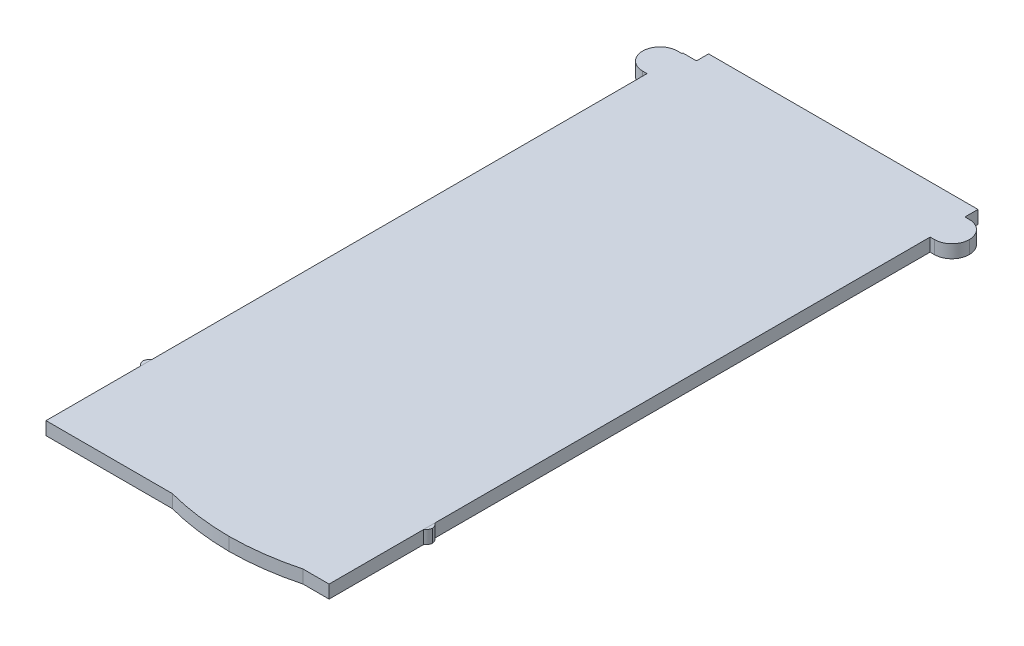
ISO-10303-21;
HEADER;
FILE_DESCRIPTION(('STEP AP214'),'2;1');
FILE_NAME('part.step','',(''),(''),'','','');
FILE_SCHEMA(('AUTOMOTIVE_DESIGN { 1 0 10303 214 1 1 1 1 }'));
ENDSEC;
DATA;
#1=APPLICATION_CONTEXT('core data for automotive mechanical design processes');
#2=APPLICATION_PROTOCOL_DEFINITION('international standard','automotive_design',2000,#1);
#3=PRODUCT_CONTEXT('',#1,'mechanical');
#4=PRODUCT('Part','Part','',(#3));
#5=PRODUCT_RELATED_PRODUCT_CATEGORY('part','',(#4));
#6=PRODUCT_DEFINITION_FORMATION('','',#4);
#7=PRODUCT_DEFINITION_CONTEXT('part definition',#1,'design');
#8=PRODUCT_DEFINITION('design','',#6,#7);
#9=PRODUCT_DEFINITION_SHAPE('','',#8);
#10=(LENGTH_UNIT() NAMED_UNIT(*) SI_UNIT(.MILLI.,.METRE.));
#11=(NAMED_UNIT(*) PLANE_ANGLE_UNIT() SI_UNIT($,.RADIAN.));
#12=(NAMED_UNIT(*) SI_UNIT($,.STERADIAN.) SOLID_ANGLE_UNIT());
#13=UNCERTAINTY_MEASURE_WITH_UNIT(LENGTH_MEASURE(1.E-05),#10,'distance_accuracy_value','');
#14=(GEOMETRIC_REPRESENTATION_CONTEXT(3) GLOBAL_UNCERTAINTY_ASSIGNED_CONTEXT((#13)) GLOBAL_UNIT_ASSIGNED_CONTEXT((#10,
#11,#12)) REPRESENTATION_CONTEXT('',''));
#15=CARTESIAN_POINT('',(0.,0.,0.));
#16=DIRECTION('',(0.,0.,1.));
#17=DIRECTION('',(1.,0.,0.));
#18=AXIS2_PLACEMENT_3D('',#15,#16,#17);
#19=CARTESIAN_POINT('',(-32.5,3.,73.));
#20=DIRECTION('',(1.,0.,0.));
#21=DIRECTION('',(0.,0.,-1.));
#22=AXIS2_PLACEMENT_3D('',#19,#20,#21);
#23=PLANE('',#22);
#24=DIRECTION('',(0.,0.,1.));
#25=VECTOR('',#24,1.);
#26=CARTESIAN_POINT('',(-32.5,0.,73.));
#27=LINE('',#26,#25);
#28=CARTESIAN_POINT('',(-32.5,0.,-62.0000000000006));
#29=VERTEX_POINT('',#28);
#30=CARTESIAN_POINT('',(-32.5,0.,51.7025621529453));
#31=VERTEX_POINT('',#30);
#32=EDGE_CURVE('E265',#29,#31,#27,.T.);
#33=ORIENTED_EDGE('',*,*,#32,.T.);
#34=DIRECTION('',(0.,1.,0.));
#35=VECTOR('',#34,1.);
#36=CARTESIAN_POINT('',(-32.5,0.,51.7025621529453));
#37=LINE('',#36,#35);
#38=CARTESIAN_POINT('',(-32.5,3.,51.7025621529453));
#39=VERTEX_POINT('',#38);
#40=EDGE_CURVE('E495',#31,#39,#37,.T.);
#41=ORIENTED_EDGE('',*,*,#40,.T.);
#42=DIRECTION('',(0.,0.,1.));
#43=VECTOR('',#42,1.);
#44=CARTESIAN_POINT('',(-32.5,3.,73.));
#45=LINE('',#44,#43);
#46=CARTESIAN_POINT('',(-32.5,3.,-62.0000000000006));
#47=VERTEX_POINT('',#46);
#48=EDGE_CURVE('E247',#47,#39,#45,.T.);
#49=ORIENTED_EDGE('',*,*,#48,.F.);
#50=DIRECTION('',(0.,-1.,0.));
#51=VECTOR('',#50,1.);
#52=CARTESIAN_POINT('',(-32.5,0.,-62.0000000000006));
#53=LINE('',#52,#51);
#54=EDGE_CURVE('E361',#47,#29,#53,.T.);
#55=ORIENTED_EDGE('',*,*,#54,.T.);
#56=EDGE_LOOP('',(#33,#41,#49,#55));
#57=FACE_BOUND('',#56,.T.);
#58=ADVANCED_FACE('F43',(#57),#23,.F.);
#59=CARTESIAN_POINT('',(32.5,3.,73.));
#60=DIRECTION('',(-1.,0.,0.));
#61=DIRECTION('',(0.,0.,1.));
#62=AXIS2_PLACEMENT_3D('',#59,#60,#61);
#63=PLANE('',#62);
#64=DIRECTION('',(0.,1.,0.));
#65=VECTOR('',#64,1.);
#66=CARTESIAN_POINT('',(32.5,0.,51.7025621529453));
#67=LINE('',#66,#65);
#68=CARTESIAN_POINT('',(32.5,0.,51.7025621529453));
#69=VERTEX_POINT('',#68);
#70=CARTESIAN_POINT('',(32.5,3.,51.7025621529453));
#71=VERTEX_POINT('',#70);
#72=EDGE_CURVE('E394',#69,#71,#67,.T.);
#73=ORIENTED_EDGE('',*,*,#72,.F.);
#74=DIRECTION('',(0.,0.,-1.));
#75=VECTOR('',#74,1.);
#76=CARTESIAN_POINT('',(32.5,0.,73.));
#77=LINE('',#76,#75);
#78=CARTESIAN_POINT('',(32.5,0.,-62.0000000000006));
#79=VERTEX_POINT('',#78);
#80=EDGE_CURVE('E259',#69,#79,#77,.T.);
#81=ORIENTED_EDGE('',*,*,#80,.T.);
#82=DIRECTION('',(0.,-1.,0.));
#83=VECTOR('',#82,1.);
#84=CARTESIAN_POINT('',(32.5,0.,-62.0000000000006));
#85=LINE('',#84,#83);
#86=CARTESIAN_POINT('',(32.5,3.,-62.0000000000006));
#87=VERTEX_POINT('',#86);
#88=EDGE_CURVE('E374',#87,#79,#85,.T.);
#89=ORIENTED_EDGE('',*,*,#88,.F.);
#90=DIRECTION('',(0.,0.,-1.));
#91=VECTOR('',#90,1.);
#92=CARTESIAN_POINT('',(32.5,3.,73.));
#93=LINE('',#92,#91);
#94=EDGE_CURVE('E251',#71,#87,#93,.T.);
#95=ORIENTED_EDGE('',*,*,#94,.F.);
#96=EDGE_LOOP('',(#73,#81,#89,#95));
#97=FACE_BOUND('',#96,.T.);
#98=ADVANCED_FACE('F392',(#97),#63,.F.);
#99=DIRECTION('',(0.,-1.,0.));
#100=VECTOR('',#99,1.);
#101=CARTESIAN_POINT('',(32.5,0.,54.3035167130892));
#102=LINE('',#101,#100);
#103=CARTESIAN_POINT('',(32.5,3.,54.3035167130892));
#104=VERTEX_POINT('',#103);
#105=CARTESIAN_POINT('',(32.5,0.,54.3035167130892));
#106=VERTEX_POINT('',#105);
#107=EDGE_CURVE('E421',#104,#106,#102,.T.);
#108=ORIENTED_EDGE('',*,*,#107,.F.);
#109=CARTESIAN_POINT('',(32.5,3.,76.));
#110=VERTEX_POINT('',#109);
#111=EDGE_CURVE('E245',#110,#104,#93,.T.);
#112=ORIENTED_EDGE('',*,*,#111,.F.);
#113=DIRECTION('',(0.,1.,0.));
#114=VECTOR('',#113,1.);
#115=CARTESIAN_POINT('',(32.5,0.,76.));
#116=LINE('',#115,#114);
#117=CARTESIAN_POINT('',(32.5,0.,76.));
#118=VERTEX_POINT('',#117);
#119=EDGE_CURVE('E329',#118,#110,#116,.T.);
#120=ORIENTED_EDGE('',*,*,#119,.F.);
#121=EDGE_CURVE('E256',#118,#106,#77,.T.);
#122=ORIENTED_EDGE('',*,*,#121,.T.);
#123=EDGE_LOOP('',(#108,#112,#120,#122));
#124=FACE_BOUND('',#123,.T.);
#125=ADVANCED_FACE('F429',(#124),#63,.F.);
#126=CARTESIAN_POINT('',(-32.5,3.,-70.2180534744469));
#127=VERTEX_POINT('',#126);
#128=CARTESIAN_POINT('',(-32.5,3.,-70.0000000000006));
#129=VERTEX_POINT('',#128);
#130=EDGE_CURVE('E249',#127,#129,#45,.T.);
#131=ORIENTED_EDGE('',*,*,#130,.F.);
#132=DIRECTION('',(0.,1.,0.));
#133=VECTOR('',#132,1.);
#134=CARTESIAN_POINT('',(-32.5,-7.,-70.2180534744469));
#135=LINE('',#134,#133);
#136=CARTESIAN_POINT('',(-32.5,0.,-70.2180534744469));
#137=VERTEX_POINT('',#136);
#138=EDGE_CURVE('E239',#137,#127,#135,.T.);
#139=ORIENTED_EDGE('',*,*,#138,.F.);
#140=CARTESIAN_POINT('',(-32.5,0.,-70.0000000000006));
#141=VERTEX_POINT('',#140);
#142=EDGE_CURVE('E263',#137,#141,#27,.T.);
#143=ORIENTED_EDGE('',*,*,#142,.T.);
#144=DIRECTION('',(0.,1.,0.));
#145=VECTOR('',#144,1.);
#146=CARTESIAN_POINT('',(-32.5,0.,-70.0000000000006));
#147=LINE('',#146,#145);
#148=EDGE_CURVE('E302',#141,#129,#147,.T.);
#149=ORIENTED_EDGE('',*,*,#148,.T.);
#150=EDGE_LOOP('',(#131,#139,#143,#149));
#151=FACE_BOUND('',#150,.T.);
#152=ADVANCED_FACE('F345',(#151),#23,.F.);
#153=DIRECTION('',(0.,1.,0.));
#154=VECTOR('',#153,1.);
#155=CARTESIAN_POINT('',(32.5,0.,-70.0000000000006));
#156=LINE('',#155,#154);
#157=CARTESIAN_POINT('',(32.5,0.,-70.0000000000006));
#158=VERTEX_POINT('',#157);
#159=CARTESIAN_POINT('',(32.5,3.,-70.0000000000006));
#160=VERTEX_POINT('',#159);
#161=EDGE_CURVE('E284',#158,#160,#156,.T.);
#162=ORIENTED_EDGE('',*,*,#161,.F.);
#163=CARTESIAN_POINT('',(32.5,0.,-73.));
#164=VERTEX_POINT('',#163);
#165=EDGE_CURVE('E260',#158,#164,#77,.T.);
#166=ORIENTED_EDGE('',*,*,#165,.T.);
#167=DIRECTION('',(0.,-1.,0.));
#168=VECTOR('',#167,1.);
#169=CARTESIAN_POINT('',(32.5,3.,-73.));
#170=LINE('',#169,#168);
#171=CARTESIAN_POINT('',(32.5,3.,-73.));
#172=VERTEX_POINT('',#171);
#173=EDGE_CURVE('E255',#172,#164,#170,.T.);
#174=ORIENTED_EDGE('',*,*,#173,.F.);
#175=EDGE_CURVE('E243',#160,#172,#93,.T.);
#176=ORIENTED_EDGE('',*,*,#175,.F.);
#177=EDGE_LOOP('',(#162,#166,#174,#176));
#178=FACE_BOUND('',#177,.T.);
#179=ADVANCED_FACE('F455',(#178),#63,.F.);
#180=CARTESIAN_POINT('',(-32.5,3.,-73.));
#181=DIRECTION('',(0.,0.,1.));
#182=DIRECTION('',(1.,0.,0.));
#183=AXIS2_PLACEMENT_3D('',#180,#181,#182);
#184=PLANE('',#183);
#185=DIRECTION('',(-1.,0.,0.));
#186=VECTOR('',#185,1.);
#187=CARTESIAN_POINT('',(-32.5,0.,-73.));
#188=LINE('',#187,#186);
#189=CARTESIAN_POINT('',(-29.3603562489109,0.,-73.));
#190=VERTEX_POINT('',#189);
#191=EDGE_CURVE('E238',#164,#190,#188,.T.);
#192=ORIENTED_EDGE('',*,*,#191,.T.);
#193=DIRECTION('',(0.,1.,0.));
#194=VECTOR('',#193,1.);
#195=CARTESIAN_POINT('',(-29.3603562489109,-7.,-73.));
#196=LINE('',#195,#194);
#197=CARTESIAN_POINT('',(-29.3603562489109,3.,-73.));
#198=VERTEX_POINT('',#197);
#199=EDGE_CURVE('E223',#190,#198,#196,.T.);
#200=ORIENTED_EDGE('',*,*,#199,.T.);
#201=DIRECTION('',(-1.,0.,0.));
#202=VECTOR('',#201,1.);
#203=CARTESIAN_POINT('',(-32.5,3.,-73.));
#204=LINE('',#203,#202);
#205=EDGE_CURVE('E235',#172,#198,#204,.T.);
#206=ORIENTED_EDGE('',*,*,#205,.F.);
#207=ORIENTED_EDGE('',*,*,#173,.T.);
#208=EDGE_LOOP('',(#192,#200,#206,#207));
#209=FACE_BOUND('',#208,.T.);
#210=ADVANCED_FACE('F233',(#209),#184,.F.);
#211=CARTESIAN_POINT('',(-32.5,3.,54.3035167130892));
#212=VERTEX_POINT('',#211);
#213=CARTESIAN_POINT('',(-32.5,3.,76.));
#214=VERTEX_POINT('',#213);
#215=EDGE_CURVE('E244',#212,#214,#45,.T.);
#216=ORIENTED_EDGE('',*,*,#215,.F.);
#217=DIRECTION('',(0.,-1.,0.));
#218=VECTOR('',#217,1.);
#219=CARTESIAN_POINT('',(-32.5,0.,54.3035167130892));
#220=LINE('',#219,#218);
#221=CARTESIAN_POINT('',(-32.5,0.,54.3035167130892));
#222=VERTEX_POINT('',#221);
#223=EDGE_CURVE('E473',#212,#222,#220,.T.);
#224=ORIENTED_EDGE('',*,*,#223,.T.);
#225=CARTESIAN_POINT('',(-32.5,0.,76.));
#226=VERTEX_POINT('',#225);
#227=EDGE_CURVE('E262',#222,#226,#27,.T.);
#228=ORIENTED_EDGE('',*,*,#227,.T.);
#229=DIRECTION('',(0.,1.,0.));
#230=VECTOR('',#229,1.);
#231=CARTESIAN_POINT('',(-32.5,0.,76.));
#232=LINE('',#231,#230);
#233=EDGE_CURVE('E476',#226,#214,#232,.T.);
#234=ORIENTED_EDGE('',*,*,#233,.T.);
#235=EDGE_LOOP('',(#216,#224,#228,#234));
#236=FACE_BOUND('',#235,.T.);
#237=ADVANCED_FACE('F450',(#236),#23,.F.);
#238=CARTESIAN_POINT('',(0.,3.,0.));
#239=DIRECTION('',(0.,-1.,0.));
#240=DIRECTION('',(0.,0.,-1.));
#241=AXIS2_PLACEMENT_3D('',#238,#239,#240);
#242=PLANE('',#241);
#243=ORIENTED_EDGE('',*,*,#205,.T.);
#244=DIRECTION('',(0.,0.,-1.));
#245=VECTOR('',#244,1.);
#246=CARTESIAN_POINT('',(-29.3603562489109,3.,-73.));
#247=LINE('',#246,#245);
#248=CARTESIAN_POINT('',(-29.3603562489109,3.,-70.2180534744469));
#249=VERTEX_POINT('',#248);
#250=EDGE_CURVE('E220',#249,#198,#247,.T.);
#251=ORIENTED_EDGE('',*,*,#250,.F.);
#252=DIRECTION('',(1.,0.,0.));
#253=VECTOR('',#252,1.);
#254=CARTESIAN_POINT('',(-29.3603562489109,3.,-70.2180534744469));
#255=LINE('',#254,#253);
#256=EDGE_CURVE('E228',#127,#249,#255,.T.);
#257=ORIENTED_EDGE('',*,*,#256,.F.);
#258=ORIENTED_EDGE('',*,*,#130,.T.);
#259=DIRECTION('',(1.,0.,0.));
#260=VECTOR('',#259,1.);
#261=CARTESIAN_POINT('',(-37.5,3.,-70.0000000000006));
#262=LINE('',#261,#260);
#263=CARTESIAN_POINT('',(-33.5,3.,-70.0000000000006));
#264=VERTEX_POINT('',#263);
#265=EDGE_CURVE('E360',#264,#129,#262,.T.);
#266=ORIENTED_EDGE('',*,*,#265,.F.);
#267=CARTESIAN_POINT('',(-33.5,3.,-66.0000000000006));
#268=DIRECTION('',(0.,-1.,0.));
#269=DIRECTION('',(0.,0.,-1.));
#270=AXIS2_PLACEMENT_3D('',#267,#268,#269);
#271=CIRCLE('',#270,4.);
#272=CARTESIAN_POINT('',(-37.5,3.,-66.0000000000006));
#273=VERTEX_POINT('',#272);
#274=EDGE_CURVE('E292',#264,#273,#271,.F.);
#275=ORIENTED_EDGE('',*,*,#274,.T.);
#276=CARTESIAN_POINT('',(-33.5,3.,-66.0000000000006));
#277=DIRECTION('',(0.,-1.,0.));
#278=DIRECTION('',(0.,0.,-1.));
#279=AXIS2_PLACEMENT_3D('',#276,#277,#278);
#280=CIRCLE('',#279,4.);
#281=CARTESIAN_POINT('',(-33.5,3.,-62.0000000000006));
#282=VERTEX_POINT('',#281);
#283=EDGE_CURVE('E294',#273,#282,#280,.F.);
#284=ORIENTED_EDGE('',*,*,#283,.T.);
#285=DIRECTION('',(1.,0.,0.));
#286=VECTOR('',#285,1.);
#287=CARTESIAN_POINT('',(-37.5,3.,-62.0000000000006));
#288=LINE('',#287,#286);
#289=EDGE_CURVE('E369',#282,#47,#288,.T.);
#290=ORIENTED_EDGE('',*,*,#289,.T.);
#291=ORIENTED_EDGE('',*,*,#48,.T.);
#292=DIRECTION('',(0.,0.,-1.));
#293=VECTOR('',#292,1.);
#294=CARTESIAN_POINT('',(-32.5,3.,0.));
#295=LINE('',#294,#293);
#296=EDGE_CURVE('E316',#212,#39,#295,.T.);
#297=ORIENTED_EDGE('',*,*,#296,.F.);
#298=ORIENTED_EDGE('',*,*,#215,.T.);
#299=DIRECTION('',(1.,0.,0.));
#300=VECTOR('',#299,1.);
#301=CARTESIAN_POINT('',(0.,3.,76.));
#302=LINE('',#301,#300);
#303=CARTESIAN_POINT('',(-3.5,3.,76.));
#304=VERTEX_POINT('',#303);
#305=EDGE_CURVE('E338',#214,#304,#302,.T.);
#306=ORIENTED_EDGE('',*,*,#305,.T.);
#307=CARTESIAN_POINT('',(11.8622914957372,3.,18.));
#308=DIRECTION('',(0.,-1.,0.));
#309=DIRECTION('',(0.,0.,-1.));
#310=AXIS2_PLACEMENT_3D('',#307,#308,#309);
#311=CIRCLE('',#310,60.);
#312=CARTESIAN_POINT('',(11.5,3.,77.9989061972976));
#313=VERTEX_POINT('',#312);
#314=EDGE_CURVE('E324',#304,#313,#311,.F.);
#315=ORIENTED_EDGE('',*,*,#314,.T.);
#316=CARTESIAN_POINT('',(11.1377085042628,3.,18.));
#317=DIRECTION('',(0.,-1.,0.));
#318=DIRECTION('',(0.,0.,-1.));
#319=AXIS2_PLACEMENT_3D('',#316,#317,#318);
#320=CIRCLE('',#319,60.);
#321=CARTESIAN_POINT('',(26.5,3.,76.));
#322=VERTEX_POINT('',#321);
#323=EDGE_CURVE('E331',#313,#322,#320,.F.);
#324=ORIENTED_EDGE('',*,*,#323,.T.);
#325=EDGE_CURVE('E507',#322,#110,#302,.T.);
#326=ORIENTED_EDGE('',*,*,#325,.T.);
#327=ORIENTED_EDGE('',*,*,#111,.T.);
#328=DIRECTION('',(0.,0.,1.));
#329=VECTOR('',#328,1.);
#330=CARTESIAN_POINT('',(32.5,3.,0.));
#331=LINE('',#330,#329);
#332=EDGE_CURVE('E303',#71,#104,#331,.T.);
#333=ORIENTED_EDGE('',*,*,#332,.F.);
#334=ORIENTED_EDGE('',*,*,#94,.T.);
#335=DIRECTION('',(-1.,0.,0.));
#336=VECTOR('',#335,1.);
#337=CARTESIAN_POINT('',(37.5,3.,-62.0000000000006));
#338=LINE('',#337,#336);
#339=CARTESIAN_POINT('',(33.5,3.,-62.0000000000006));
#340=VERTEX_POINT('',#339);
#341=EDGE_CURVE('E382',#340,#87,#338,.T.);
#342=ORIENTED_EDGE('',*,*,#341,.F.);
#343=CARTESIAN_POINT('',(33.5,3.,-66.0000000000006));
#344=DIRECTION('',(0.,-1.,0.));
#345=DIRECTION('',(0.,0.,-1.));
#346=AXIS2_PLACEMENT_3D('',#343,#344,#345);
#347=CIRCLE('',#346,4.);
#348=CARTESIAN_POINT('',(37.5,3.,-66.0000000000006));
#349=VERTEX_POINT('',#348);
#350=EDGE_CURVE('E276',#340,#349,#347,.F.);
#351=ORIENTED_EDGE('',*,*,#350,.T.);
#352=CARTESIAN_POINT('',(33.5,3.,-66.0000000000006));
#353=DIRECTION('',(0.,-1.,0.));
#354=DIRECTION('',(0.,0.,-1.));
#355=AXIS2_PLACEMENT_3D('',#352,#353,#354);
#356=CIRCLE('',#355,4.);
#357=CARTESIAN_POINT('',(33.5,3.,-70.0000000000006));
#358=VERTEX_POINT('',#357);
#359=EDGE_CURVE('E274',#349,#358,#356,.F.);
#360=ORIENTED_EDGE('',*,*,#359,.T.);
#361=DIRECTION('',(-1.,0.,0.));
#362=VECTOR('',#361,1.);
#363=CARTESIAN_POINT('',(37.5,3.,-70.0000000000006));
#364=LINE('',#363,#362);
#365=EDGE_CURVE('E384',#358,#160,#364,.T.);
#366=ORIENTED_EDGE('',*,*,#365,.T.);
#367=ORIENTED_EDGE('',*,*,#175,.T.);
#368=EDGE_LOOP('',(#243,#251,#257,#258,#266,#275,#284,#290,#291,#297,#298,#306,#315,#324,#326,
#327,#333,#334,#342,#351,#360,#366,#367));
#369=FACE_BOUND('',#368,.T.);
#370=ADVANCED_FACE('F241',(#369),#242,.F.);
#371=CARTESIAN_POINT('',(0.,0.,0.));
#372=DIRECTION('',(0.,-1.,0.));
#373=DIRECTION('',(0.,0.,-1.));
#374=AXIS2_PLACEMENT_3D('',#371,#372,#373);
#375=PLANE('',#374);
#376=DIRECTION('',(0.,0.,1.));
#377=VECTOR('',#376,1.);
#378=CARTESIAN_POINT('',(-29.3603562489109,0.,0.));
#379=LINE('',#378,#377);
#380=CARTESIAN_POINT('',(-29.3603562489109,0.,-70.2180534744469));
#381=VERTEX_POINT('',#380);
#382=EDGE_CURVE('E11',#190,#381,#379,.T.);
#383=ORIENTED_EDGE('',*,*,#382,.F.);
#384=ORIENTED_EDGE('',*,*,#191,.F.);
#385=ORIENTED_EDGE('',*,*,#165,.F.);
#386=DIRECTION('',(-1.,0.,0.));
#387=VECTOR('',#386,1.);
#388=CARTESIAN_POINT('',(37.5,0.,-70.0000000000006));
#389=LINE('',#388,#387);
#390=CARTESIAN_POINT('',(33.5,0.,-70.0000000000006));
#391=VERTEX_POINT('',#390);
#392=EDGE_CURVE('E377',#391,#158,#389,.T.);
#393=ORIENTED_EDGE('',*,*,#392,.F.);
#394=CARTESIAN_POINT('',(33.5,0.,-66.0000000000006));
#395=DIRECTION('',(0.,-1.,0.));
#396=DIRECTION('',(0.,0.,-1.));
#397=AXIS2_PLACEMENT_3D('',#394,#395,#396);
#398=CIRCLE('',#397,4.);
#399=CARTESIAN_POINT('',(37.5,0.,-66.0000000000006));
#400=VERTEX_POINT('',#399);
#401=EDGE_CURVE('E267',#391,#400,#398,.T.);
#402=ORIENTED_EDGE('',*,*,#401,.T.);
#403=CARTESIAN_POINT('',(33.5,0.,-66.0000000000006));
#404=DIRECTION('',(0.,-1.,0.));
#405=DIRECTION('',(0.,0.,-1.));
#406=AXIS2_PLACEMENT_3D('',#403,#404,#405);
#407=CIRCLE('',#406,4.);
#408=CARTESIAN_POINT('',(33.5,0.,-62.0000000000006));
#409=VERTEX_POINT('',#408);
#410=EDGE_CURVE('E269',#400,#409,#407,.T.);
#411=ORIENTED_EDGE('',*,*,#410,.T.);
#412=DIRECTION('',(-1.,0.,0.));
#413=VECTOR('',#412,1.);
#414=CARTESIAN_POINT('',(37.5,0.,-62.0000000000006));
#415=LINE('',#414,#413);
#416=EDGE_CURVE('E379',#409,#79,#415,.T.);
#417=ORIENTED_EDGE('',*,*,#416,.T.);
#418=ORIENTED_EDGE('',*,*,#80,.F.);
#419=CARTESIAN_POINT('',(31.3,0.,53.3025621529453));
#420=DIRECTION('',(0.,-1.,0.));
#421=DIRECTION('',(0.,0.,-1.));
#422=AXIS2_PLACEMENT_3D('',#419,#420,#421);
#423=CIRCLE('',#422,2.);
#424=CARTESIAN_POINT('',(33.2774443456762,0.,53.0030394330172));
#425=VERTEX_POINT('',#424);
#426=EDGE_CURVE('E309',#69,#425,#423,.T.);
#427=ORIENTED_EDGE('',*,*,#426,.T.);
#428=CARTESIAN_POINT('',(31.3,0.,52.7035167130892));
#429=DIRECTION('',(0.,-1.,0.));
#430=DIRECTION('',(0.,0.,-1.));
#431=AXIS2_PLACEMENT_3D('',#428,#429,#430);
#432=CIRCLE('',#431,2.);
#433=EDGE_CURVE('E307',#425,#106,#432,.T.);
#434=ORIENTED_EDGE('',*,*,#433,.T.);
#435=ORIENTED_EDGE('',*,*,#121,.F.);
#436=DIRECTION('',(1.,0.,0.));
#437=VECTOR('',#436,1.);
#438=CARTESIAN_POINT('',(0.,0.,76.));
#439=LINE('',#438,#437);
#440=CARTESIAN_POINT('',(26.5,0.,76.));
#441=VERTEX_POINT('',#440);
#442=EDGE_CURVE('E433',#441,#118,#439,.T.);
#443=ORIENTED_EDGE('',*,*,#442,.F.);
#444=CARTESIAN_POINT('',(11.1377085042628,0.,18.));
#445=DIRECTION('',(0.,-1.,0.));
#446=DIRECTION('',(0.,0.,-1.));
#447=AXIS2_PLACEMENT_3D('',#444,#445,#446);
#448=CIRCLE('',#447,60.);
#449=CARTESIAN_POINT('',(11.5,0.,77.9989061972976));
#450=VERTEX_POINT('',#449);
#451=EDGE_CURVE('E65',#441,#450,#448,.T.);
#452=ORIENTED_EDGE('',*,*,#451,.T.);
#453=CARTESIAN_POINT('',(11.8622914957372,0.,18.));
#454=DIRECTION('',(0.,-1.,0.));
#455=DIRECTION('',(0.,0.,-1.));
#456=AXIS2_PLACEMENT_3D('',#453,#454,#455);
#457=CIRCLE('',#456,60.);
#458=CARTESIAN_POINT('',(-3.5,0.,76.));
#459=VERTEX_POINT('',#458);
#460=EDGE_CURVE('E333',#450,#459,#457,.T.);
#461=ORIENTED_EDGE('',*,*,#460,.T.);
#462=EDGE_CURVE('E508',#226,#459,#439,.T.);
#463=ORIENTED_EDGE('',*,*,#462,.F.);
#464=ORIENTED_EDGE('',*,*,#227,.F.);
#465=CARTESIAN_POINT('',(-31.3,0.,52.7035167130892));
#466=DIRECTION('',(0.,-1.,0.));
#467=DIRECTION('',(0.,0.,-1.));
#468=AXIS2_PLACEMENT_3D('',#465,#466,#467);
#469=CIRCLE('',#468,2.);
#470=CARTESIAN_POINT('',(-33.2774443456762,0.,53.0030394330172));
#471=VERTEX_POINT('',#470);
#472=EDGE_CURVE('E320',#222,#471,#469,.T.);
#473=ORIENTED_EDGE('',*,*,#472,.T.);
#474=CARTESIAN_POINT('',(-31.3,0.,53.3025621529453));
#475=DIRECTION('',(0.,-1.,0.));
#476=DIRECTION('',(0.,0.,-1.));
#477=AXIS2_PLACEMENT_3D('',#474,#475,#476);
#478=CIRCLE('',#477,2.);
#479=EDGE_CURVE('E322',#471,#31,#478,.T.);
#480=ORIENTED_EDGE('',*,*,#479,.T.);
#481=ORIENTED_EDGE('',*,*,#32,.F.);
#482=DIRECTION('',(1.,0.,0.));
#483=VECTOR('',#482,1.);
#484=CARTESIAN_POINT('',(-37.5,0.,-62.0000000000006));
#485=LINE('',#484,#483);
#486=CARTESIAN_POINT('',(-33.5,0.,-62.0000000000006));
#487=VERTEX_POINT('',#486);
#488=EDGE_CURVE('E355',#487,#29,#485,.T.);
#489=ORIENTED_EDGE('',*,*,#488,.F.);
#490=CARTESIAN_POINT('',(-33.5,0.,-66.0000000000006));
#491=DIRECTION('',(0.,-1.,0.));
#492=DIRECTION('',(0.,0.,-1.));
#493=AXIS2_PLACEMENT_3D('',#490,#491,#492);
#494=CIRCLE('',#493,4.);
#495=CARTESIAN_POINT('',(-37.5,0.,-66.0000000000006));
#496=VERTEX_POINT('',#495);
#497=EDGE_CURVE('E290',#487,#496,#494,.T.);
#498=ORIENTED_EDGE('',*,*,#497,.T.);
#499=CARTESIAN_POINT('',(-33.5,0.,-66.0000000000006));
#500=DIRECTION('',(0.,-1.,0.));
#501=DIRECTION('',(0.,0.,-1.));
#502=AXIS2_PLACEMENT_3D('',#499,#500,#501);
#503=CIRCLE('',#502,4.);
#504=CARTESIAN_POINT('',(-33.5,0.,-70.0000000000006));
#505=VERTEX_POINT('',#504);
#506=EDGE_CURVE('E288',#496,#505,#503,.T.);
#507=ORIENTED_EDGE('',*,*,#506,.T.);
#508=DIRECTION('',(1.,0.,0.));
#509=VECTOR('',#508,1.);
#510=CARTESIAN_POINT('',(-37.5,0.,-70.0000000000006));
#511=LINE('',#510,#509);
#512=EDGE_CURVE('E285',#505,#141,#511,.T.);
#513=ORIENTED_EDGE('',*,*,#512,.T.);
#514=ORIENTED_EDGE('',*,*,#142,.F.);
#515=DIRECTION('',(-1.,0.,0.));
#516=VECTOR('',#515,1.);
#517=CARTESIAN_POINT('',(0.,0.,-70.2180534744469));
#518=LINE('',#517,#516);
#519=EDGE_CURVE('E51',#381,#137,#518,.T.);
#520=ORIENTED_EDGE('',*,*,#519,.F.);
#521=EDGE_LOOP('',(#383,#384,#385,#393,#402,#411,#417,#418,#427,#434,#435,#443,#452,#461,#463,
#464,#473,#480,#481,#489,#498,#507,#513,#514,#520));
#522=FACE_BOUND('',#521,.T.);
#523=ADVANCED_FACE('F349',(#522),#375,.T.);
#524=CARTESIAN_POINT('',(37.5,0.,-70.0000000000006));
#525=DIRECTION('',(0.,0.,1.));
#526=DIRECTION('',(1.,0.,0.));
#527=AXIS2_PLACEMENT_3D('',#524,#525,#526);
#528=PLANE('',#527);
#529=ORIENTED_EDGE('',*,*,#365,.F.);
#530=DIRECTION('',(0.,1.,0.));
#531=VECTOR('',#530,1.);
#532=CARTESIAN_POINT('',(33.5,0.,-70.0000000000006));
#533=LINE('',#532,#531);
#534=EDGE_CURVE('E278',#358,#391,#533,.F.);
#535=ORIENTED_EDGE('',*,*,#534,.T.);
#536=ORIENTED_EDGE('',*,*,#392,.T.);
#537=ORIENTED_EDGE('',*,*,#161,.T.);
#538=EDGE_LOOP('',(#529,#535,#536,#537));
#539=FACE_BOUND('',#538,.T.);
#540=ADVANCED_FACE('F700',(#539),#528,.F.);
#541=CARTESIAN_POINT('',(37.5,0.,-62.0000000000006));
#542=DIRECTION('',(0.,0.,-1.));
#543=DIRECTION('',(-1.,0.,0.));
#544=AXIS2_PLACEMENT_3D('',#541,#542,#543);
#545=PLANE('',#544);
#546=ORIENTED_EDGE('',*,*,#416,.F.);
#547=DIRECTION('',(0.,-1.,0.));
#548=VECTOR('',#547,1.);
#549=CARTESIAN_POINT('',(33.5,3.,-62.0000000000006));
#550=LINE('',#549,#548);
#551=EDGE_CURVE('E271',#409,#340,#550,.F.);
#552=ORIENTED_EDGE('',*,*,#551,.T.);
#553=ORIENTED_EDGE('',*,*,#341,.T.);
#554=ORIENTED_EDGE('',*,*,#88,.T.);
#555=EDGE_LOOP('',(#546,#552,#553,#554));
#556=FACE_BOUND('',#555,.T.);
#557=ADVANCED_FACE('F400',(#556),#545,.F.);
#558=CARTESIAN_POINT('',(33.5,0.,-66.0000000000006));
#559=DIRECTION('',(0.,-1.,0.));
#560=DIRECTION('',(0.,0.,-1.));
#561=AXIS2_PLACEMENT_3D('',#558,#559,#560);
#562=CYLINDRICAL_SURFACE('',#561,4.);
#563=ORIENTED_EDGE('',*,*,#534,.F.);
#564=ORIENTED_EDGE('',*,*,#359,.F.);
#565=DIRECTION('',(0.,1.,0.));
#566=VECTOR('',#565,1.);
#567=CARTESIAN_POINT('',(37.5,3.,-66.0000000000006));
#568=LINE('',#567,#566);
#569=EDGE_CURVE('E281',#400,#349,#568,.T.);
#570=ORIENTED_EDGE('',*,*,#569,.F.);
#571=ORIENTED_EDGE('',*,*,#401,.F.);
#572=EDGE_LOOP('',(#563,#564,#570,#571));
#573=FACE_BOUND('',#572,.T.);
#574=ADVANCED_FACE('F680',(#573),#562,.T.);
#575=CARTESIAN_POINT('',(33.5,0.,-66.0000000000006));
#576=DIRECTION('',(0.,1.,0.));
#577=DIRECTION('',(0.,0.,1.));
#578=AXIS2_PLACEMENT_3D('',#575,#576,#577);
#579=CYLINDRICAL_SURFACE('',#578,4.);
#580=ORIENTED_EDGE('',*,*,#350,.F.);
#581=ORIENTED_EDGE('',*,*,#551,.F.);
#582=ORIENTED_EDGE('',*,*,#410,.F.);
#583=ORIENTED_EDGE('',*,*,#569,.T.);
#584=EDGE_LOOP('',(#580,#581,#582,#583));
#585=FACE_BOUND('',#584,.T.);
#586=ADVANCED_FACE('F670',(#585),#579,.T.);
#587=CARTESIAN_POINT('',(-37.5,0.,-70.0000000000006));
#588=DIRECTION('',(0.,0.,-1.));
#589=DIRECTION('',(-1.,0.,0.));
#590=AXIS2_PLACEMENT_3D('',#587,#588,#589);
#591=PLANE('',#590);
#592=ORIENTED_EDGE('',*,*,#512,.F.);
#593=DIRECTION('',(0.,1.,0.));
#594=VECTOR('',#593,1.);
#595=CARTESIAN_POINT('',(-33.5,0.,-70.0000000000006));
#596=LINE('',#595,#594);
#597=EDGE_CURVE('E296',#505,#264,#596,.T.);
#598=ORIENTED_EDGE('',*,*,#597,.T.);
#599=ORIENTED_EDGE('',*,*,#265,.T.);
#600=ORIENTED_EDGE('',*,*,#148,.F.);
#601=EDGE_LOOP('',(#592,#598,#599,#600));
#602=FACE_BOUND('',#601,.T.);
#603=ADVANCED_FACE('F358',(#602),#591,.T.);
#604=CARTESIAN_POINT('',(-37.5,0.,-62.0000000000006));
#605=DIRECTION('',(0.,0.,1.));
#606=DIRECTION('',(1.,0.,0.));
#607=AXIS2_PLACEMENT_3D('',#604,#605,#606);
#608=PLANE('',#607);
#609=ORIENTED_EDGE('',*,*,#289,.F.);
#610=DIRECTION('',(0.,-1.,0.));
#611=VECTOR('',#610,1.);
#612=CARTESIAN_POINT('',(-33.5,0.,-62.0000000000006));
#613=LINE('',#612,#611);
#614=EDGE_CURVE('E280',#282,#487,#613,.T.);
#615=ORIENTED_EDGE('',*,*,#614,.T.);
#616=ORIENTED_EDGE('',*,*,#488,.T.);
#617=ORIENTED_EDGE('',*,*,#54,.F.);
#618=EDGE_LOOP('',(#609,#615,#616,#617));
#619=FACE_BOUND('',#618,.T.);
#620=ADVANCED_FACE('F522',(#619),#608,.T.);
#621=CARTESIAN_POINT('',(-33.5,0.,-66.0000000000006));
#622=DIRECTION('',(0.,1.,0.));
#623=DIRECTION('',(0.,0.,1.));
#624=AXIS2_PLACEMENT_3D('',#621,#622,#623);
#625=CYLINDRICAL_SURFACE('',#624,4.);
#626=DIRECTION('',(0.,1.,0.));
#627=VECTOR('',#626,1.);
#628=CARTESIAN_POINT('',(-37.5,0.,-66.0000000000006));
#629=LINE('',#628,#627);
#630=EDGE_CURVE('E299',#273,#496,#629,.F.);
#631=ORIENTED_EDGE('',*,*,#630,.F.);
#632=ORIENTED_EDGE('',*,*,#274,.F.);
#633=ORIENTED_EDGE('',*,*,#597,.F.);
#634=ORIENTED_EDGE('',*,*,#506,.F.);
#635=EDGE_LOOP('',(#631,#632,#633,#634));
#636=FACE_BOUND('',#635,.T.);
#637=ADVANCED_FACE('F515',(#636),#625,.T.);
#638=CARTESIAN_POINT('',(-33.5,0.,-66.0000000000006));
#639=DIRECTION('',(0.,-1.,0.));
#640=DIRECTION('',(0.,0.,-1.));
#641=AXIS2_PLACEMENT_3D('',#638,#639,#640);
#642=CYLINDRICAL_SURFACE('',#641,4.);
#643=ORIENTED_EDGE('',*,*,#283,.F.);
#644=ORIENTED_EDGE('',*,*,#630,.T.);
#645=ORIENTED_EDGE('',*,*,#497,.F.);
#646=ORIENTED_EDGE('',*,*,#614,.F.);
#647=EDGE_LOOP('',(#643,#644,#645,#646));
#648=FACE_BOUND('',#647,.T.);
#649=ADVANCED_FACE('F444',(#648),#642,.T.);
#650=CARTESIAN_POINT('',(32.5,0.,0.));
#651=DIRECTION('',(1.,0.,0.));
#652=DIRECTION('',(0.,0.,-1.));
#653=AXIS2_PLACEMENT_3D('',#650,#651,#652);
#654=PLANE('',#653);
#655=CARTESIAN_POINT('',(32.5,3.0011014155507,51.7025621529453));
#656=VERTEX_POINT('',#655);
#657=EDGE_CURVE('E315',#71,#656,#67,.T.);
#658=ORIENTED_EDGE('',*,*,#657,.F.);
#659=ORIENTED_EDGE('',*,*,#332,.T.);
#660=CARTESIAN_POINT('',(32.5,3.0011014155507,54.3035167130892));
#661=VERTEX_POINT('',#660);
#662=EDGE_CURVE('E410',#661,#104,#102,.T.);
#663=ORIENTED_EDGE('',*,*,#662,.F.);
#664=DIRECTION('',(0.,0.,1.));
#665=VECTOR('',#664,1.);
#666=CARTESIAN_POINT('',(32.5,3.0011014155507,51.7025621529453));
#667=LINE('',#666,#665);
#668=EDGE_CURVE('E414',#656,#661,#667,.T.);
#669=ORIENTED_EDGE('',*,*,#668,.F.);
#670=EDGE_LOOP('',(#658,#659,#663,#669));
#671=FACE_BOUND('',#670,.T.);
#672=ADVANCED_FACE('F413',(#671),#654,.F.);
#673=CARTESIAN_POINT('',(33.3,3.0011014155507,51.7025621529453));
#674=DIRECTION('',(0.,-1.,0.));
#675=DIRECTION('',(0.,0.,-1.));
#676=AXIS2_PLACEMENT_3D('',#673,#674,#675);
#677=PLANE('',#676);
#678=CARTESIAN_POINT('',(31.3,3.0011014155507,52.7035167130892));
#679=DIRECTION('',(0.,-1.,0.));
#680=DIRECTION('',(0.,0.,-1.));
#681=AXIS2_PLACEMENT_3D('',#678,#679,#680);
#682=CIRCLE('',#681,2.);
#683=CARTESIAN_POINT('',(33.2774443456762,3.0011014155507,53.0030394330172));
#684=VERTEX_POINT('',#683);
#685=EDGE_CURVE('E298',#661,#684,#682,.F.);
#686=ORIENTED_EDGE('',*,*,#685,.T.);
#687=CARTESIAN_POINT('',(31.3,3.0011014155507,53.3025621529453));
#688=DIRECTION('',(0.,-1.,0.));
#689=DIRECTION('',(0.,0.,-1.));
#690=AXIS2_PLACEMENT_3D('',#687,#688,#689);
#691=CIRCLE('',#690,2.);
#692=EDGE_CURVE('E305',#684,#656,#691,.F.);
#693=ORIENTED_EDGE('',*,*,#692,.T.);
#694=ORIENTED_EDGE('',*,*,#668,.T.);
#695=EDGE_LOOP('',(#686,#693,#694));
#696=FACE_BOUND('',#695,.T.);
#697=ADVANCED_FACE('F436',(#696),#677,.F.);
#698=CARTESIAN_POINT('',(31.3,0.,52.7035167130892));
#699=DIRECTION('',(0.,1.,0.));
#700=DIRECTION('',(0.,0.,1.));
#701=AXIS2_PLACEMENT_3D('',#698,#699,#700);
#702=CYLINDRICAL_SURFACE('',#701,2.);
#703=ORIENTED_EDGE('',*,*,#107,.T.);
#704=ORIENTED_EDGE('',*,*,#433,.F.);
#705=DIRECTION('',(0.,1.,0.));
#706=VECTOR('',#705,1.);
#707=CARTESIAN_POINT('',(33.2774443456762,1.50055070777535,53.0030394330172));
#708=LINE('',#707,#706);
#709=EDGE_CURVE('E312',#684,#425,#708,.F.);
#710=ORIENTED_EDGE('',*,*,#709,.F.);
#711=ORIENTED_EDGE('',*,*,#685,.F.);
#712=ORIENTED_EDGE('',*,*,#662,.T.);
#713=EDGE_LOOP('',(#703,#704,#710,#711,#712));
#714=FACE_BOUND('',#713,.T.);
#715=ADVANCED_FACE('F426',(#714),#702,.T.);
#716=CARTESIAN_POINT('',(31.3,0.,53.3025621529453));
#717=DIRECTION('',(0.,1.,0.));
#718=DIRECTION('',(0.,0.,1.));
#719=AXIS2_PLACEMENT_3D('',#716,#717,#718);
#720=CYLINDRICAL_SURFACE('',#719,2.);
#721=ORIENTED_EDGE('',*,*,#72,.T.);
#722=ORIENTED_EDGE('',*,*,#657,.T.);
#723=ORIENTED_EDGE('',*,*,#692,.F.);
#724=ORIENTED_EDGE('',*,*,#709,.T.);
#725=ORIENTED_EDGE('',*,*,#426,.F.);
#726=EDGE_LOOP('',(#721,#722,#723,#724,#725));
#727=FACE_BOUND('',#726,.T.);
#728=ADVANCED_FACE('F434',(#727),#720,.T.);
#729=CARTESIAN_POINT('',(-32.5,0.,0.));
#730=DIRECTION('',(-1.,0.,0.));
#731=DIRECTION('',(0.,0.,-1.));
#732=AXIS2_PLACEMENT_3D('',#729,#730,#731);
#733=PLANE('',#732);
#734=CARTESIAN_POINT('',(-32.5,3.0011014155507,54.3035167130892));
#735=VERTEX_POINT('',#734);
#736=EDGE_CURVE('E487',#735,#212,#220,.T.);
#737=ORIENTED_EDGE('',*,*,#736,.T.);
#738=ORIENTED_EDGE('',*,*,#296,.T.);
#739=CARTESIAN_POINT('',(-32.5,3.0011014155507,51.7025621529453));
#740=VERTEX_POINT('',#739);
#741=EDGE_CURVE('E328',#39,#740,#37,.T.);
#742=ORIENTED_EDGE('',*,*,#741,.T.);
#743=DIRECTION('',(0.,0.,1.));
#744=VECTOR('',#743,1.);
#745=CARTESIAN_POINT('',(-32.5,3.0011014155507,51.7025621529453));
#746=LINE('',#745,#744);
#747=EDGE_CURVE('E484',#740,#735,#746,.T.);
#748=ORIENTED_EDGE('',*,*,#747,.T.);
#749=EDGE_LOOP('',(#737,#738,#742,#748));
#750=FACE_BOUND('',#749,.T.);
#751=ADVANCED_FACE('F488',(#750),#733,.F.);
#752=CARTESIAN_POINT('',(-33.3,3.0011014155507,51.7025621529453));
#753=DIRECTION('',(0.,1.,0.));
#754=DIRECTION('',(0.,0.,1.));
#755=AXIS2_PLACEMENT_3D('',#752,#753,#754);
#756=PLANE('',#755);
#757=ORIENTED_EDGE('',*,*,#747,.F.);
#758=CARTESIAN_POINT('',(-31.3,3.0011014155507,53.3025621529453));
#759=DIRECTION('',(0.,1.,0.));
#760=DIRECTION('',(0.,0.,1.));
#761=AXIS2_PLACEMENT_3D('',#758,#759,#760);
#762=CIRCLE('',#761,2.);
#763=CARTESIAN_POINT('',(-33.2774443456762,3.0011014155507,53.0030394330172));
#764=VERTEX_POINT('',#763);
#765=EDGE_CURVE('E318',#740,#764,#762,.T.);
#766=ORIENTED_EDGE('',*,*,#765,.T.);
#767=CARTESIAN_POINT('',(-31.3,3.0011014155507,52.7035167130892));
#768=DIRECTION('',(0.,1.,0.));
#769=DIRECTION('',(0.,0.,1.));
#770=AXIS2_PLACEMENT_3D('',#767,#768,#769);
#771=CIRCLE('',#770,2.);
#772=EDGE_CURVE('E311',#764,#735,#771,.T.);
#773=ORIENTED_EDGE('',*,*,#772,.T.);
#774=EDGE_LOOP('',(#757,#766,#773));
#775=FACE_BOUND('',#774,.T.);
#776=ADVANCED_FACE('F531',(#775),#756,.T.);
#777=CARTESIAN_POINT('',(-31.3,0.,52.7035167130892));
#778=DIRECTION('',(0.,-1.,0.));
#779=DIRECTION('',(0.,0.,-1.));
#780=AXIS2_PLACEMENT_3D('',#777,#778,#779);
#781=CYLINDRICAL_SURFACE('',#780,2.);
#782=DIRECTION('',(0.,-1.,0.));
#783=VECTOR('',#782,1.);
#784=CARTESIAN_POINT('',(-33.2774443456762,1.50055070777535,53.0030394330172));
#785=LINE('',#784,#783);
#786=EDGE_CURVE('E325',#471,#764,#785,.F.);
#787=ORIENTED_EDGE('',*,*,#786,.F.);
#788=ORIENTED_EDGE('',*,*,#472,.F.);
#789=ORIENTED_EDGE('',*,*,#223,.F.);
#790=ORIENTED_EDGE('',*,*,#736,.F.);
#791=ORIENTED_EDGE('',*,*,#772,.F.);
#792=EDGE_LOOP('',(#787,#788,#789,#790,#791));
#793=FACE_BOUND('',#792,.T.);
#794=ADVANCED_FACE('F494',(#793),#781,.T.);
#795=CARTESIAN_POINT('',(-31.3,0.,53.3025621529453));
#796=DIRECTION('',(0.,-1.,0.));
#797=DIRECTION('',(0.,0.,-1.));
#798=AXIS2_PLACEMENT_3D('',#795,#796,#797);
#799=CYLINDRICAL_SURFACE('',#798,2.);
#800=ORIENTED_EDGE('',*,*,#479,.F.);
#801=ORIENTED_EDGE('',*,*,#786,.T.);
#802=ORIENTED_EDGE('',*,*,#765,.F.);
#803=ORIENTED_EDGE('',*,*,#741,.F.);
#804=ORIENTED_EDGE('',*,*,#40,.F.);
#805=EDGE_LOOP('',(#800,#801,#802,#803,#804));
#806=FACE_BOUND('',#805,.T.);
#807=ADVANCED_FACE('F528',(#806),#799,.T.);
#808=CARTESIAN_POINT('',(0.,0.,76.));
#809=DIRECTION('',(0.,0.,1.));
#810=DIRECTION('',(1.,0.,0.));
#811=AXIS2_PLACEMENT_3D('',#808,#809,#810);
#812=PLANE('',#811);
#813=ORIENTED_EDGE('',*,*,#325,.F.);
#814=DIRECTION('',(0.,1.,0.));
#815=VECTOR('',#814,1.);
#816=CARTESIAN_POINT('',(26.5,0.,76.));
#817=LINE('',#816,#815);
#818=EDGE_CURVE('E502',#441,#322,#817,.T.);
#819=ORIENTED_EDGE('',*,*,#818,.F.);
#820=ORIENTED_EDGE('',*,*,#442,.T.);
#821=ORIENTED_EDGE('',*,*,#119,.T.);
#822=EDGE_LOOP('',(#813,#819,#820,#821));
#823=FACE_BOUND('',#822,.T.);
#824=ADVANCED_FACE('F541',(#823),#812,.T.);
#825=ORIENTED_EDGE('',*,*,#305,.F.);
#826=ORIENTED_EDGE('',*,*,#233,.F.);
#827=ORIENTED_EDGE('',*,*,#462,.T.);
#828=DIRECTION('',(0.,1.,0.));
#829=VECTOR('',#828,1.);
#830=CARTESIAN_POINT('',(-3.5,0.,76.));
#831=LINE('',#830,#829);
#832=EDGE_CURVE('E500',#459,#304,#831,.T.);
#833=ORIENTED_EDGE('',*,*,#832,.T.);
#834=EDGE_LOOP('',(#825,#826,#827,#833));
#835=FACE_BOUND('',#834,.T.);
#836=ADVANCED_FACE('F544',(#835),#812,.T.);
#837=CARTESIAN_POINT('',(11.8622914957372,0.,18.));
#838=DIRECTION('',(0.,1.,0.));
#839=DIRECTION('',(0.,0.,1.));
#840=AXIS2_PLACEMENT_3D('',#837,#838,#839);
#841=CYLINDRICAL_SURFACE('',#840,60.);
#842=ORIENTED_EDGE('',*,*,#832,.F.);
#843=ORIENTED_EDGE('',*,*,#460,.F.);
#844=DIRECTION('',(0.,1.,0.));
#845=VECTOR('',#844,1.);
#846=CARTESIAN_POINT('',(11.5,1.5,77.9989061972976));
#847=LINE('',#846,#845);
#848=EDGE_CURVE('E336',#313,#450,#847,.F.);
#849=ORIENTED_EDGE('',*,*,#848,.F.);
#850=ORIENTED_EDGE('',*,*,#314,.F.);
#851=EDGE_LOOP('',(#842,#843,#849,#850));
#852=FACE_BOUND('',#851,.T.);
#853=ADVANCED_FACE('F45',(#852),#841,.T.);
#854=CARTESIAN_POINT('',(11.1377085042628,0.,18.));
#855=DIRECTION('',(0.,1.,0.));
#856=DIRECTION('',(0.,0.,1.));
#857=AXIS2_PLACEMENT_3D('',#854,#855,#856);
#858=CYLINDRICAL_SURFACE('',#857,60.);
#859=ORIENTED_EDGE('',*,*,#451,.F.);
#860=ORIENTED_EDGE('',*,*,#818,.T.);
#861=ORIENTED_EDGE('',*,*,#323,.F.);
#862=ORIENTED_EDGE('',*,*,#848,.T.);
#863=EDGE_LOOP('',(#859,#860,#861,#862));
#864=FACE_BOUND('',#863,.T.);
#865=ADVANCED_FACE('F548',(#864),#858,.T.);
#866=CARTESIAN_POINT('',(-29.3603562489109,-7.,-73.));
#867=DIRECTION('',(1.,0.,0.));
#868=DIRECTION('',(0.,0.,-1.));
#869=AXIS2_PLACEMENT_3D('',#866,#867,#868);
#870=PLANE('',#869);
#871=ORIENTED_EDGE('',*,*,#382,.T.);
#872=DIRECTION('',(0.,1.,0.));
#873=VECTOR('',#872,1.);
#874=CARTESIAN_POINT('',(-29.3603562489109,-7.,-70.2180534744469));
#875=LINE('',#874,#873);
#876=EDGE_CURVE('E58',#381,#249,#875,.T.);
#877=ORIENTED_EDGE('',*,*,#876,.T.);
#878=ORIENTED_EDGE('',*,*,#250,.T.);
#879=ORIENTED_EDGE('',*,*,#199,.F.);
#880=EDGE_LOOP('',(#871,#877,#878,#879));
#881=FACE_BOUND('',#880,.T.);
#882=ADVANCED_FACE('F222',(#881),#870,.F.);
#883=CARTESIAN_POINT('',(-29.3603562489109,-7.,-70.2180534744469));
#884=DIRECTION('',(0.,0.,1.));
#885=DIRECTION('',(1.,0.,0.));
#886=AXIS2_PLACEMENT_3D('',#883,#884,#885);
#887=PLANE('',#886);
#888=ORIENTED_EDGE('',*,*,#519,.T.);
#889=ORIENTED_EDGE('',*,*,#138,.T.);
#890=ORIENTED_EDGE('',*,*,#256,.T.);
#891=ORIENTED_EDGE('',*,*,#876,.F.);
#892=EDGE_LOOP('',(#888,#889,#890,#891));
#893=FACE_BOUND('',#892,.T.);
#894=ADVANCED_FACE('F341',(#893),#887,.F.);
#895=CLOSED_SHELL('',(#58,#98,#125,#152,#179,#210,#237,#370,#523,#540,#557,#574,#586,#603,#620,
#637,#649,#672,#697,#715,#728,#751,#776,#794,#807,#824,#836,#853,#865,#882,#894));
#896=MANIFOLD_SOLID_BREP('B2',#895);
#897=ADVANCED_BREP_SHAPE_REPRESENTATION('',(#18,#896),#14);
#898=SHAPE_DEFINITION_REPRESENTATION(#9,#897);
ENDSEC;
END-ISO-10303-21;
